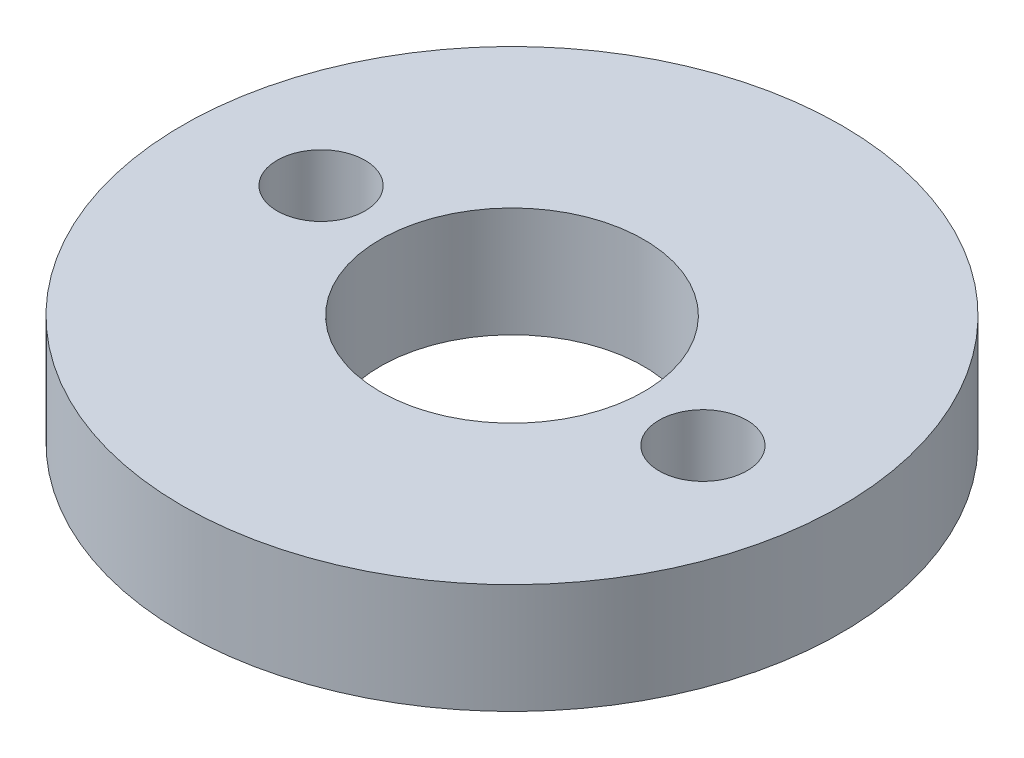
ISO-10303-21;
HEADER;
FILE_DESCRIPTION(('STEP AP214'),'2;1');
FILE_NAME('part.step','',(''),(''),'','','');
FILE_SCHEMA(('AUTOMOTIVE_DESIGN { 1 0 10303 214 1 1 1 1 }'));
ENDSEC;
DATA;
#1=APPLICATION_CONTEXT('core data for automotive mechanical design processes');
#2=APPLICATION_PROTOCOL_DEFINITION('international standard','automotive_design',2000,#1);
#3=PRODUCT_CONTEXT('',#1,'mechanical');
#4=PRODUCT('Part','Part','',(#3));
#5=PRODUCT_RELATED_PRODUCT_CATEGORY('part','',(#4));
#6=PRODUCT_DEFINITION_FORMATION('','',#4);
#7=PRODUCT_DEFINITION_CONTEXT('part definition',#1,'design');
#8=PRODUCT_DEFINITION('design','',#6,#7);
#9=PRODUCT_DEFINITION_SHAPE('','',#8);
#10=(LENGTH_UNIT() NAMED_UNIT(*) SI_UNIT(.MILLI.,.METRE.));
#11=(NAMED_UNIT(*) PLANE_ANGLE_UNIT() SI_UNIT($,.RADIAN.));
#12=(NAMED_UNIT(*) SI_UNIT($,.STERADIAN.) SOLID_ANGLE_UNIT());
#13=UNCERTAINTY_MEASURE_WITH_UNIT(LENGTH_MEASURE(1.E-05),#10,'distance_accuracy_value','');
#14=(GEOMETRIC_REPRESENTATION_CONTEXT(3) GLOBAL_UNCERTAINTY_ASSIGNED_CONTEXT((#13)) GLOBAL_UNIT_ASSIGNED_CONTEXT((#10,
#11,#12)) REPRESENTATION_CONTEXT('',''));
#15=CARTESIAN_POINT('',(0.,0.,0.));
#16=DIRECTION('',(0.,0.,1.));
#17=DIRECTION('',(1.,0.,0.));
#18=AXIS2_PLACEMENT_3D('',#15,#16,#17);
#19=CARTESIAN_POINT('',(0.,5.,0.));
#20=DIRECTION('',(0.,1.,0.));
#21=DIRECTION('',(0.,0.,1.));
#22=AXIS2_PLACEMENT_3D('',#19,#20,#21);
#23=PLANE('',#22);
#24=CARTESIAN_POINT('',(9.46814080243986,5.,0.777373620065282));
#25=DIRECTION('',(0.,-1.,0.));
#26=DIRECTION('',(0.,0.,-1.));
#27=AXIS2_PLACEMENT_3D('',#24,#25,#26);
#28=CIRCLE('',#27,2.);
#29=CARTESIAN_POINT('',(9.46814080243986,5.,-1.22262637993472));
#30=VERTEX_POINT('',#29);
#31=EDGE_CURVE('E53',#30,#30,#28,.T.);
#32=ORIENTED_EDGE('',*,*,#31,.T.);
#33=EDGE_LOOP('',(#32));
#34=FACE_BOUND('',#33,.T.);
#35=CARTESIAN_POINT('',(-9.46814080243986,5.,-0.777373620065282));
#36=DIRECTION('',(0.,-1.,0.));
#37=DIRECTION('',(0.,0.,-1.));
#38=AXIS2_PLACEMENT_3D('',#35,#36,#37);
#39=CIRCLE('',#38,2.);
#40=CARTESIAN_POINT('',(-9.46814080243986,5.,-2.77737362006528));
#41=VERTEX_POINT('',#40);
#42=EDGE_CURVE('E47',#41,#41,#39,.T.);
#43=ORIENTED_EDGE('',*,*,#42,.T.);
#44=EDGE_LOOP('',(#43));
#45=FACE_BOUND('',#44,.T.);
#46=CARTESIAN_POINT('',(0.,5.,0.));
#47=DIRECTION('',(0.,1.,0.));
#48=DIRECTION('',(0.,0.,1.));
#49=AXIS2_PLACEMENT_3D('',#46,#47,#48);
#50=CIRCLE('',#49,15.);
#51=CARTESIAN_POINT('',(0.,5.,15.));
#52=VERTEX_POINT('',#51);
#53=EDGE_CURVE('E10',#52,#52,#50,.T.);
#54=ORIENTED_EDGE('',*,*,#53,.T.);
#55=EDGE_LOOP('',(#54));
#56=FACE_BOUND('',#55,.T.);
#57=CARTESIAN_POINT('',(0.,5.,0.));
#58=DIRECTION('',(0.,1.,0.));
#59=DIRECTION('',(0.,0.,1.));
#60=AXIS2_PLACEMENT_3D('',#57,#58,#59);
#61=CIRCLE('',#60,6.);
#62=CARTESIAN_POINT('',(0.,5.,6.));
#63=VERTEX_POINT('',#62);
#64=EDGE_CURVE('E42',#63,#63,#61,.T.);
#65=ORIENTED_EDGE('',*,*,#64,.F.);
#66=EDGE_LOOP('',(#65));
#67=FACE_BOUND('',#66,.T.);
#68=ADVANCED_FACE('F31',(#34,#45,#56,#67),#23,.T.);
#69=CARTESIAN_POINT('',(0.,0.,0.));
#70=DIRECTION('',(0.,1.,0.));
#71=DIRECTION('',(0.,0.,1.));
#72=AXIS2_PLACEMENT_3D('',#69,#70,#71);
#73=PLANE('',#72);
#74=CARTESIAN_POINT('',(9.46814080243986,0.,0.777373620065282));
#75=DIRECTION('',(0.,-1.,0.));
#76=DIRECTION('',(0.,0.,-1.));
#77=AXIS2_PLACEMENT_3D('',#74,#75,#76);
#78=CIRCLE('',#77,2.);
#79=CARTESIAN_POINT('',(9.46814080243986,0.,-1.22262637993472));
#80=VERTEX_POINT('',#79);
#81=EDGE_CURVE('E56',#80,#80,#78,.T.);
#82=ORIENTED_EDGE('',*,*,#81,.F.);
#83=EDGE_LOOP('',(#82));
#84=FACE_BOUND('',#83,.T.);
#85=CARTESIAN_POINT('',(-9.46814080243986,0.,-0.777373620065282));
#86=DIRECTION('',(0.,-1.,0.));
#87=DIRECTION('',(0.,0.,-1.));
#88=AXIS2_PLACEMENT_3D('',#85,#86,#87);
#89=CIRCLE('',#88,2.);
#90=CARTESIAN_POINT('',(-9.46814080243986,0.,-2.77737362006528));
#91=VERTEX_POINT('',#90);
#92=EDGE_CURVE('E50',#91,#91,#89,.T.);
#93=ORIENTED_EDGE('',*,*,#92,.F.);
#94=EDGE_LOOP('',(#93));
#95=FACE_BOUND('',#94,.T.);
#96=CARTESIAN_POINT('',(0.,0.,0.));
#97=DIRECTION('',(0.,1.,0.));
#98=DIRECTION('',(0.,0.,1.));
#99=AXIS2_PLACEMENT_3D('',#96,#97,#98);
#100=CIRCLE('',#99,15.);
#101=CARTESIAN_POINT('',(0.,0.,15.));
#102=VERTEX_POINT('',#101);
#103=EDGE_CURVE('E35',#102,#102,#100,.T.);
#104=ORIENTED_EDGE('',*,*,#103,.F.);
#105=EDGE_LOOP('',(#104));
#106=FACE_BOUND('',#105,.T.);
#107=CARTESIAN_POINT('',(0.,0.,0.));
#108=DIRECTION('',(0.,1.,0.));
#109=DIRECTION('',(0.,0.,1.));
#110=AXIS2_PLACEMENT_3D('',#107,#108,#109);
#111=CIRCLE('',#110,6.);
#112=CARTESIAN_POINT('',(0.,0.,6.));
#113=VERTEX_POINT('',#112);
#114=EDGE_CURVE('E44',#113,#113,#111,.T.);
#115=ORIENTED_EDGE('',*,*,#114,.T.);
#116=EDGE_LOOP('',(#115));
#117=FACE_BOUND('',#116,.T.);
#118=ADVANCED_FACE('F71',(#84,#95,#106,#117),#73,.F.);
#119=CARTESIAN_POINT('',(0.,5.,0.));
#120=DIRECTION('',(0.,-1.,0.));
#121=DIRECTION('',(0.,0.,-1.));
#122=AXIS2_PLACEMENT_3D('',#119,#120,#121);
#123=CYLINDRICAL_SURFACE('',#122,15.);
#124=ORIENTED_EDGE('',*,*,#53,.F.);
#125=EDGE_LOOP('',(#124));
#126=FACE_BOUND('',#125,.T.);
#127=ORIENTED_EDGE('',*,*,#103,.T.);
#128=EDGE_LOOP('',(#127));
#129=FACE_BOUND('',#128,.T.);
#130=ADVANCED_FACE('F33',(#126,#129),#123,.T.);
#131=CARTESIAN_POINT('',(0.,5.,0.));
#132=DIRECTION('',(0.,-1.,0.));
#133=DIRECTION('',(0.,0.,-1.));
#134=AXIS2_PLACEMENT_3D('',#131,#132,#133);
#135=CYLINDRICAL_SURFACE('',#134,6.);
#136=ORIENTED_EDGE('',*,*,#64,.T.);
#137=EDGE_LOOP('',(#136));
#138=FACE_BOUND('',#137,.T.);
#139=ORIENTED_EDGE('',*,*,#114,.F.);
#140=EDGE_LOOP('',(#139));
#141=FACE_BOUND('',#140,.T.);
#142=ADVANCED_FACE('F80',(#138,#141),#135,.F.);
#143=CARTESIAN_POINT('',(-9.46814080243986,5.,-0.777373620065282));
#144=DIRECTION('',(0.,-1.,0.));
#145=DIRECTION('',(0.,0.,-1.));
#146=AXIS2_PLACEMENT_3D('',#143,#144,#145);
#147=CYLINDRICAL_SURFACE('',#146,2.);
#148=ORIENTED_EDGE('',*,*,#42,.F.);
#149=EDGE_LOOP('',(#148));
#150=FACE_BOUND('',#149,.T.);
#151=ORIENTED_EDGE('',*,*,#92,.T.);
#152=EDGE_LOOP('',(#151));
#153=FACE_BOUND('',#152,.T.);
#154=ADVANCED_FACE('F67',(#150,#153),#147,.F.);
#155=CARTESIAN_POINT('',(9.46814080243986,5.,0.777373620065282));
#156=DIRECTION('',(0.,-1.,0.));
#157=DIRECTION('',(0.,0.,-1.));
#158=AXIS2_PLACEMENT_3D('',#155,#156,#157);
#159=CYLINDRICAL_SURFACE('',#158,2.);
#160=ORIENTED_EDGE('',*,*,#31,.F.);
#161=EDGE_LOOP('',(#160));
#162=FACE_BOUND('',#161,.T.);
#163=ORIENTED_EDGE('',*,*,#81,.T.);
#164=EDGE_LOOP('',(#163));
#165=FACE_BOUND('',#164,.T.);
#166=ADVANCED_FACE('F64',(#162,#165),#159,.F.);
#167=CLOSED_SHELL('',(#68,#118,#130,#142,#154,#166));
#168=MANIFOLD_SOLID_BREP('B2',#167);
#169=ADVANCED_BREP_SHAPE_REPRESENTATION('',(#18,#168),#14);
#170=SHAPE_DEFINITION_REPRESENTATION(#9,#169);
ENDSEC;
END-ISO-10303-21;
